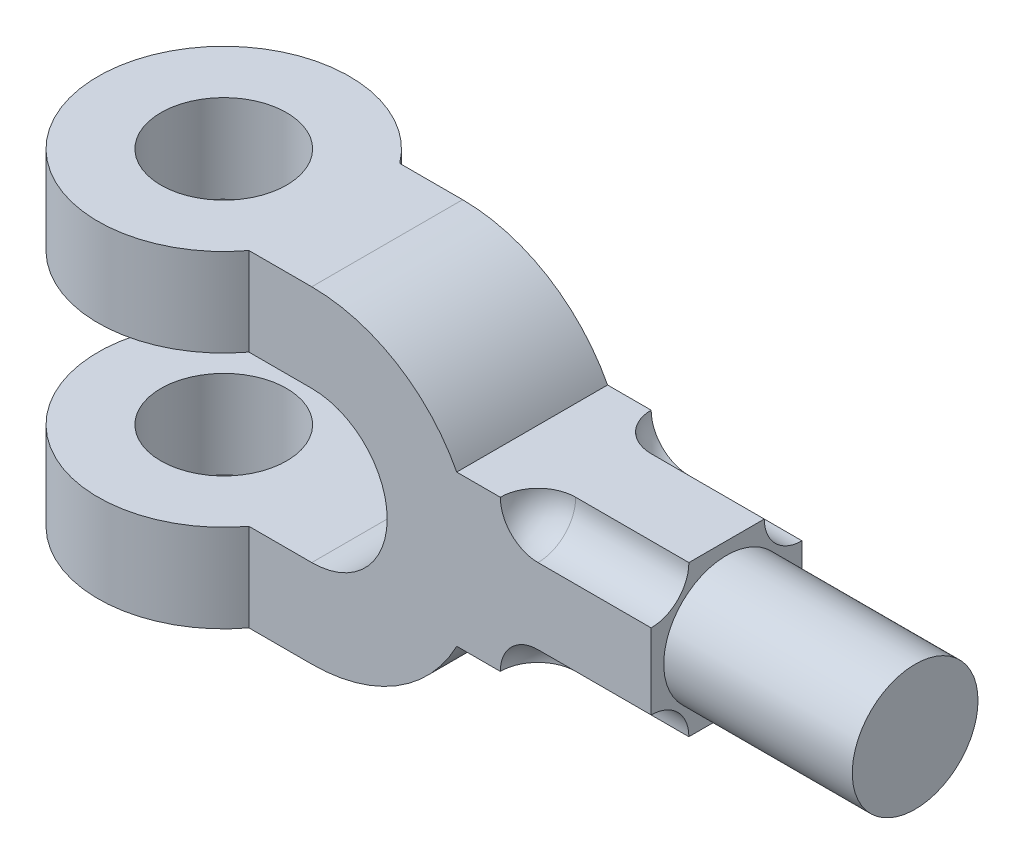
ISO-10303-21;
HEADER;
FILE_DESCRIPTION(('STEP AP214'),'2;1');
FILE_NAME('part.step','',(''),(''),'','','');
FILE_SCHEMA(('AUTOMOTIVE_DESIGN { 1 0 10303 214 1 1 1 1 }'));
ENDSEC;
DATA;
#1=APPLICATION_CONTEXT('core data for automotive mechanical design processes');
#2=APPLICATION_PROTOCOL_DEFINITION('international standard','automotive_design',2000,#1);
#3=PRODUCT_CONTEXT('',#1,'mechanical');
#4=PRODUCT('Part','Part','',(#3));
#5=PRODUCT_RELATED_PRODUCT_CATEGORY('part','',(#4));
#6=PRODUCT_DEFINITION_FORMATION('','',#4);
#7=PRODUCT_DEFINITION_CONTEXT('part definition',#1,'design');
#8=PRODUCT_DEFINITION('design','',#6,#7);
#9=PRODUCT_DEFINITION_SHAPE('','',#8);
#10=(LENGTH_UNIT() NAMED_UNIT(*) SI_UNIT(.MILLI.,.METRE.));
#11=(NAMED_UNIT(*) PLANE_ANGLE_UNIT() SI_UNIT($,.RADIAN.));
#12=(NAMED_UNIT(*) SI_UNIT($,.STERADIAN.) SOLID_ANGLE_UNIT());
#13=UNCERTAINTY_MEASURE_WITH_UNIT(LENGTH_MEASURE(1.E-05),#10,'distance_accuracy_value','');
#14=(GEOMETRIC_REPRESENTATION_CONTEXT(3) GLOBAL_UNCERTAINTY_ASSIGNED_CONTEXT((#13)) GLOBAL_UNIT_ASSIGNED_CONTEXT((#10,
#11,#12)) REPRESENTATION_CONTEXT('',''));
#15=CARTESIAN_POINT('',(0.,0.,0.));
#16=DIRECTION('',(0.,0.,1.));
#17=DIRECTION('',(1.,0.,0.));
#18=AXIS2_PLACEMENT_3D('',#15,#16,#17);
#19=CARTESIAN_POINT('',(0.,52.,0.));
#20=DIRECTION('',(0.,-1.,0.));
#21=DIRECTION('',(0.,0.,-1.));
#22=AXIS2_PLACEMENT_3D('',#19,#20,#21);
#23=CYLINDRICAL_SURFACE('',#22,20.);
#24=DIRECTION('',(0.,-1.,0.));
#25=VECTOR('',#24,1.);
#26=CARTESIAN_POINT('',(15.9999999999998,14.,11.9999999999998));
#27=LINE('',#26,#25);
#28=CARTESIAN_POINT('',(16.,14.,11.9999999999998));
#29=VERTEX_POINT('',#28);
#30=CARTESIAN_POINT('',(16.,0.,11.9999999999998));
#31=VERTEX_POINT('',#30);
#32=EDGE_CURVE('E474',#29,#31,#27,.T.);
#33=ORIENTED_EDGE('',*,*,#32,.F.);
#34=CARTESIAN_POINT('',(0.,14.,0.));
#35=DIRECTION('',(0.,-1.,0.));
#36=DIRECTION('',(0.,0.,-1.));
#37=AXIS2_PLACEMENT_3D('',#34,#35,#36);
#38=CIRCLE('',#37,20.);
#39=CARTESIAN_POINT('',(16.,14.,-12.0000000000002));
#40=VERTEX_POINT('',#39);
#41=EDGE_CURVE('E427',#29,#40,#38,.T.);
#42=ORIENTED_EDGE('',*,*,#41,.T.);
#43=DIRECTION('',(0.,-1.,0.));
#44=VECTOR('',#43,1.);
#45=CARTESIAN_POINT('',(15.9999999999999,14.,-12.0000000000002));
#46=LINE('',#45,#44);
#47=CARTESIAN_POINT('',(16.,0.,-12.0000000000002));
#48=VERTEX_POINT('',#47);
#49=EDGE_CURVE('E225',#40,#48,#46,.T.);
#50=ORIENTED_EDGE('',*,*,#49,.T.);
#51=CARTESIAN_POINT('',(0.,0.,0.));
#52=DIRECTION('',(0.,1.,0.));
#53=DIRECTION('',(0.,0.,1.));
#54=AXIS2_PLACEMENT_3D('',#51,#52,#53);
#55=CIRCLE('',#54,20.);
#56=EDGE_CURVE('E278',#48,#31,#55,.T.);
#57=ORIENTED_EDGE('',*,*,#56,.T.);
#58=EDGE_LOOP('',(#33,#42,#50,#57));
#59=FACE_BOUND('',#58,.T.);
#60=ADVANCED_FACE('F44',(#59),#23,.T.);
#61=DIRECTION('',(0.,-1.,0.));
#62=VECTOR('',#61,1.);
#63=CARTESIAN_POINT('',(15.9999999999999,52.,-12.0000000000002));
#64=LINE('',#63,#62);
#65=CARTESIAN_POINT('',(15.9999999999999,52.,-12.0000000000002));
#66=VERTEX_POINT('',#65);
#67=CARTESIAN_POINT('',(16.,38.,-12.0000000000002));
#68=VERTEX_POINT('',#67);
#69=EDGE_CURVE('E196',#66,#68,#64,.T.);
#70=ORIENTED_EDGE('',*,*,#69,.T.);
#71=CARTESIAN_POINT('',(0.,38.,0.));
#72=DIRECTION('',(0.,1.,0.));
#73=DIRECTION('',(0.,0.,1.));
#74=AXIS2_PLACEMENT_3D('',#71,#72,#73);
#75=CIRCLE('',#74,20.);
#76=CARTESIAN_POINT('',(15.9999999999999,38.,11.9999999999998));
#77=VERTEX_POINT('',#76);
#78=EDGE_CURVE('E181',#68,#77,#75,.T.);
#79=ORIENTED_EDGE('',*,*,#78,.T.);
#80=DIRECTION('',(0.,-1.,0.));
#81=VECTOR('',#80,1.);
#82=CARTESIAN_POINT('',(15.9999999999998,52.,11.9999999999998));
#83=LINE('',#82,#81);
#84=CARTESIAN_POINT('',(16.,52.,11.9999999999998));
#85=VERTEX_POINT('',#84);
#86=EDGE_CURVE('E464',#85,#77,#83,.T.);
#87=ORIENTED_EDGE('',*,*,#86,.F.);
#88=CARTESIAN_POINT('',(0.,52.,0.));
#89=DIRECTION('',(0.,1.,0.));
#90=DIRECTION('',(0.,0.,1.));
#91=AXIS2_PLACEMENT_3D('',#88,#89,#90);
#92=CIRCLE('',#91,20.);
#93=EDGE_CURVE('E203',#66,#85,#92,.T.);
#94=ORIENTED_EDGE('',*,*,#93,.F.);
#95=EDGE_LOOP('',(#70,#79,#87,#94));
#96=FACE_BOUND('',#95,.T.);
#97=ADVANCED_FACE('F200',(#96),#23,.T.);
#98=CARTESIAN_POINT('',(0.,0.,0.));
#99=DIRECTION('',(0.,1.,0.));
#100=DIRECTION('',(0.,0.,1.));
#101=AXIS2_PLACEMENT_3D('',#98,#99,#100);
#102=CYLINDRICAL_SURFACE('',#101,10.);
#103=CARTESIAN_POINT('',(0.,14.,0.));
#104=DIRECTION('',(0.,-1.,0.));
#105=DIRECTION('',(0.,0.,-1.));
#106=AXIS2_PLACEMENT_3D('',#103,#104,#105);
#107=CIRCLE('',#106,10.);
#108=CARTESIAN_POINT('',(0.,14.,10.));
#109=VERTEX_POINT('',#108);
#110=EDGE_CURVE('E47',#109,#109,#107,.F.);
#111=CARTESIAN_POINT('',(0.,0.,0.));
#112=DIRECTION('',(0.,1.,0.));
#113=DIRECTION('',(0.,0.,1.));
#114=AXIS2_PLACEMENT_3D('',#111,#112,#113);
#115=CIRCLE('',#114,10.);
#116=CARTESIAN_POINT('',(0.,0.,10.));
#117=VERTEX_POINT('',#116);
#118=EDGE_CURVE('E277',#117,#117,#115,.T.);
#119=CARTESIAN_POINT('',(0.,14.,10.));
#120=CARTESIAN_POINT('',(0.,13.8541666666667,10.));
#121=CARTESIAN_POINT('',(0.,13.7083333333333,10.));
#122=CARTESIAN_POINT('',(0.,13.4166666666667,10.));
#123=CARTESIAN_POINT('',(0.,13.2708333333333,10.));
#124=CARTESIAN_POINT('',(0.,12.9791666666667,10.));
#125=CARTESIAN_POINT('',(0.,12.8333333333333,10.));
#126=CARTESIAN_POINT('',(0.,12.5416666666667,10.));
#127=CARTESIAN_POINT('',(0.,12.3958333333333,10.));
#128=CARTESIAN_POINT('',(0.,12.1041666666667,10.));
#129=CARTESIAN_POINT('',(0.,11.9583333333333,10.));
#130=CARTESIAN_POINT('',(0.,11.6666666666667,10.));
#131=CARTESIAN_POINT('',(0.,11.5208333333333,10.));
#132=CARTESIAN_POINT('',(0.,11.2291666666667,10.));
#133=CARTESIAN_POINT('',(0.,11.0833333333333,10.));
#134=CARTESIAN_POINT('',(0.,10.7916666666667,10.));
#135=CARTESIAN_POINT('',(0.,10.6458333333333,10.));
#136=CARTESIAN_POINT('',(0.,10.3541666666667,10.));
#137=CARTESIAN_POINT('',(0.,10.2083333333333,10.));
#138=CARTESIAN_POINT('',(0.,9.91666666666668,10.));
#139=CARTESIAN_POINT('',(0.,9.77083333333334,10.));
#140=CARTESIAN_POINT('',(0.,9.47916666666668,10.));
#141=CARTESIAN_POINT('',(0.,9.33333333333334,10.));
#142=CARTESIAN_POINT('',(0.,9.04166666666667,10.));
#143=CARTESIAN_POINT('',(0.,8.89583333333334,10.));
#144=CARTESIAN_POINT('',(0.,8.60416666666667,10.));
#145=CARTESIAN_POINT('',(0.,8.45833333333334,10.));
#146=CARTESIAN_POINT('',(0.,8.16666666666667,10.));
#147=CARTESIAN_POINT('',(0.,8.02083333333334,10.));
#148=CARTESIAN_POINT('',(0.,7.72916666666667,10.));
#149=CARTESIAN_POINT('',(0.,7.58333333333334,10.));
#150=CARTESIAN_POINT('',(0.,7.29166666666667,10.));
#151=CARTESIAN_POINT('',(0.,7.14583333333334,10.));
#152=CARTESIAN_POINT('',(0.,6.85416666666667,10.));
#153=CARTESIAN_POINT('',(0.,6.70833333333334,10.));
#154=CARTESIAN_POINT('',(0.,6.41666666666667,10.));
#155=CARTESIAN_POINT('',(0.,6.27083333333334,10.));
#156=CARTESIAN_POINT('',(0.,5.97916666666667,10.));
#157=CARTESIAN_POINT('',(0.,5.83333333333334,10.));
#158=CARTESIAN_POINT('',(0.,5.54166666666667,10.));
#159=CARTESIAN_POINT('',(0.,5.39583333333334,10.));
#160=CARTESIAN_POINT('',(0.,5.10416666666667,10.));
#161=CARTESIAN_POINT('',(0.,4.95833333333334,10.));
#162=CARTESIAN_POINT('',(0.,4.66666666666667,10.));
#163=CARTESIAN_POINT('',(0.,4.52083333333334,10.));
#164=CARTESIAN_POINT('',(0.,4.22916666666667,10.));
#165=CARTESIAN_POINT('',(0.,4.08333333333334,10.));
#166=CARTESIAN_POINT('',(0.,3.79166666666667,10.));
#167=CARTESIAN_POINT('',(0.,3.64583333333334,10.));
#168=CARTESIAN_POINT('',(0.,3.35416666666667,10.));
#169=CARTESIAN_POINT('',(0.,3.20833333333334,10.));
#170=CARTESIAN_POINT('',(0.,2.91666666666667,10.));
#171=CARTESIAN_POINT('',(0.,2.77083333333334,10.));
#172=CARTESIAN_POINT('',(0.,2.47916666666667,10.));
#173=CARTESIAN_POINT('',(0.,2.33333333333333,10.));
#174=CARTESIAN_POINT('',(0.,2.04166666666667,10.));
#175=CARTESIAN_POINT('',(0.,1.89583333333333,10.));
#176=CARTESIAN_POINT('',(0.,1.60416666666667,10.));
#177=CARTESIAN_POINT('',(0.,1.45833333333333,10.));
#178=CARTESIAN_POINT('',(0.,1.16666666666667,10.));
#179=CARTESIAN_POINT('',(0.,1.02083333333333,10.));
#180=CARTESIAN_POINT('',(0.,0.729166666666667,10.));
#181=CARTESIAN_POINT('',(0.,0.583333333333334,10.));
#182=CARTESIAN_POINT('',(0.,0.291666666666667,10.));
#183=CARTESIAN_POINT('',(0.,0.145833333333333,10.));
#184=CARTESIAN_POINT('',(0.,0.,10.));
#185=B_SPLINE_CURVE_WITH_KNOTS('',3,(#119,#120,#121,#122,#123,#124,#125,#126,#127,#128,#129,
#130,#131,#132,#133,#134,#135,#136,#137,#138,#139,#140,#141,#142,#143,#144,#145,#146,#147,#148,
#149,#150,#151,#152,#153,#154,#155,#156,#157,#158,#159,#160,#161,#162,#163,#164,#165,#166,#167,
#168,#169,#170,#171,#172,#173,#174,#175,#176,#177,#178,#179,#180,#181,#182,#183,#184),
.UNSPECIFIED.,.F.,.F.,(4,2,2,2,2,2,2,2,2,2,2,2,2,2,2,2,2,2,2,2,2,2,2,2,2,2,2,2,2,2,2,2,4),(0.,
0.4375,0.875000000000001,1.3125,1.75,2.1875,2.625,3.0625,3.5,3.9375,4.375,4.8125,
5.25000000000001,5.68750000000001,6.12500000000001,6.56250000000001,7.00000000000001,
7.43750000000001,7.87500000000001,8.31250000000001,8.75000000000001,9.18750000000001,
9.62500000000001,10.0625,10.5,10.9375,11.375,11.8125,12.25,12.6875,13.125,13.5625,14.),.UNSPECIFIED.);
#186=EDGE_CURVE('BSEAM303',#109,#117,#185,.T.);
#187=ORIENTED_EDGE('',*,*,#110,.T.);
#188=ORIENTED_EDGE('',*,*,#118,.F.);
#189=ORIENTED_EDGE('',*,*,#186,.T.);
#190=ORIENTED_EDGE('',*,*,#186,.F.);
#191=EDGE_LOOP('',(#187,#189,#188,#190));
#192=FACE_BOUND('',#191,.T.);
#193=ADVANCED_FACE('F303',(#192),#102,.F.);
#194=CARTESIAN_POINT('',(49.0651251893416,14.,11.9999999999891));
#195=DIRECTION('',(0.,1.,0.));
#196=DIRECTION('',(-1.,0.,0.));
#197=AXIS2_PLACEMENT_3D('',#194,#195,#196);
#198=PLANE('',#197);
#199=DIRECTION('',(-1.,0.,0.));
#200=VECTOR('',#199,1.);
#201=CARTESIAN_POINT('',(109.999999999995,14.,6.00000000000001));
#202=LINE('',#201,#200);
#203=CARTESIAN_POINT('',(61.9999999999946,14.,5.99999999999246));
#204=VERTEX_POINT('',#203);
#205=CARTESIAN_POINT('',(79.9999999999946,14.,5.99999999998913));
#206=VERTEX_POINT('',#205);
#207=EDGE_CURVE('E447',#204,#206,#202,.F.);
#208=ORIENTED_EDGE('',*,*,#207,.F.);
#209=CARTESIAN_POINT('',(61.9999999999999,14.,11.9999999999925));
#210=DIRECTION('',(0.,1.,0.));
#211=DIRECTION('',(-1.,0.,0.));
#212=AXIS2_PLACEMENT_3D('',#209,#210,#211);
#213=CIRCLE('',#212,6.);
#214=CARTESIAN_POINT('',(55.9999999999999,14.,11.9999999999925));
#215=VERTEX_POINT('',#214);
#216=EDGE_CURVE('E356',#204,#215,#213,.T.);
#217=ORIENTED_EDGE('',*,*,#216,.T.);
#218=DIRECTION('',(1.,0.,0.));
#219=VECTOR('',#218,1.);
#220=CARTESIAN_POINT('',(49.0651251893416,14.,11.9999999999891));
#221=LINE('',#220,#219);
#222=CARTESIAN_POINT('',(49.0651251893416,14.,11.9999999999891));
#223=VERTEX_POINT('',#222);
#224=EDGE_CURVE('E484',#223,#215,#221,.T.);
#225=ORIENTED_EDGE('',*,*,#224,.F.);
#226=DIRECTION('',(0.,0.,-1.));
#227=VECTOR('',#226,1.);
#228=CARTESIAN_POINT('',(49.0651251893416,14.,11.9999999999891));
#229=LINE('',#228,#227);
#230=CARTESIAN_POINT('',(49.0651251893416,14.,-12.0000000000107));
#231=VERTEX_POINT('',#230);
#232=EDGE_CURVE('E258',#223,#231,#229,.T.);
#233=ORIENTED_EDGE('',*,*,#232,.T.);
#234=DIRECTION('',(1.,0.,0.));
#235=VECTOR('',#234,1.);
#236=CARTESIAN_POINT('',(49.0651251893416,14.,-12.0000000000107));
#237=LINE('',#236,#235);
#238=CARTESIAN_POINT('',(56.,14.,-12.0000000000076));
#239=VERTEX_POINT('',#238);
#240=EDGE_CURVE('E231',#231,#239,#237,.T.);
#241=ORIENTED_EDGE('',*,*,#240,.T.);
#242=CARTESIAN_POINT('',(62.0000000000001,14.,-12.0000000000076));
#243=DIRECTION('',(0.,1.,0.));
#244=DIRECTION('',(-1.,0.,0.));
#245=AXIS2_PLACEMENT_3D('',#242,#243,#244);
#246=CIRCLE('',#245,6.);
#247=CARTESIAN_POINT('',(61.9999999999999,14.,-6.00000000000755));
#248=VERTEX_POINT('',#247);
#249=EDGE_CURVE('E353',#239,#248,#246,.T.);
#250=ORIENTED_EDGE('',*,*,#249,.T.);
#251=DIRECTION('',(-1.,0.,0.));
#252=VECTOR('',#251,1.);
#253=CARTESIAN_POINT('',(110.,14.,-6.00000000000001));
#254=LINE('',#253,#252);
#255=CARTESIAN_POINT('',(80.,14.,-6.00000000001066));
#256=VERTEX_POINT('',#255);
#257=EDGE_CURVE('E430',#256,#248,#254,.T.);
#258=ORIENTED_EDGE('',*,*,#257,.F.);
#259=DIRECTION('',(0.,0.,-1.));
#260=VECTOR('',#259,1.);
#261=CARTESIAN_POINT('',(80.,14.,11.9999999999891));
#262=LINE('',#261,#260);
#263=EDGE_CURVE('E252',#206,#256,#262,.T.);
#264=ORIENTED_EDGE('',*,*,#263,.F.);
#265=EDGE_LOOP('',(#208,#217,#225,#233,#241,#250,#258,#264));
#266=FACE_BOUND('',#265,.T.);
#267=ADVANCED_FACE('F521',(#266),#198,.F.);
#268=CARTESIAN_POINT('',(49.0651251893416,38.,11.9999999999891));
#269=DIRECTION('',(0.,-1.,0.));
#270=DIRECTION('',(0.,0.,-1.));
#271=AXIS2_PLACEMENT_3D('',#268,#269,#270);
#272=PLANE('',#271);
#273=DIRECTION('',(-1.,0.,0.));
#274=VECTOR('',#273,1.);
#275=CARTESIAN_POINT('',(110.,38.,-6.00000000000001));
#276=LINE('',#275,#274);
#277=CARTESIAN_POINT('',(61.9999999999999,38.,-6.00000000000755));
#278=VERTEX_POINT('',#277);
#279=CARTESIAN_POINT('',(80.,38.,-6.00000000001066));
#280=VERTEX_POINT('',#279);
#281=EDGE_CURVE('E411',#278,#280,#276,.F.);
#282=ORIENTED_EDGE('',*,*,#281,.F.);
#283=CARTESIAN_POINT('',(62.0000000000001,38.,-12.0000000000076));
#284=DIRECTION('',(0.,-1.,0.));
#285=DIRECTION('',(0.,0.,-1.));
#286=AXIS2_PLACEMENT_3D('',#283,#284,#285);
#287=CIRCLE('',#286,6.);
#288=CARTESIAN_POINT('',(56.,38.,-12.0000000000076));
#289=VERTEX_POINT('',#288);
#290=EDGE_CURVE('E368',#278,#289,#287,.T.);
#291=ORIENTED_EDGE('',*,*,#290,.T.);
#292=DIRECTION('',(-1.,0.,0.));
#293=VECTOR('',#292,1.);
#294=CARTESIAN_POINT('',(49.0651251893416,38.,-12.0000000000107));
#295=LINE('',#294,#293);
#296=CARTESIAN_POINT('',(49.0651251893416,38.,-12.0000000000107));
#297=VERTEX_POINT('',#296);
#298=EDGE_CURVE('E239',#289,#297,#295,.T.);
#299=ORIENTED_EDGE('',*,*,#298,.T.);
#300=DIRECTION('',(0.,0.,-1.));
#301=VECTOR('',#300,1.);
#302=CARTESIAN_POINT('',(49.0651251893416,38.,11.9999999999891));
#303=LINE('',#302,#301);
#304=CARTESIAN_POINT('',(49.0651251893416,38.,11.9999999999891));
#305=VERTEX_POINT('',#304);
#306=EDGE_CURVE('E241',#305,#297,#303,.T.);
#307=ORIENTED_EDGE('',*,*,#306,.F.);
#308=DIRECTION('',(-1.,0.,0.));
#309=VECTOR('',#308,1.);
#310=CARTESIAN_POINT('',(49.0651251893416,38.,11.9999999999891));
#311=LINE('',#310,#309);
#312=CARTESIAN_POINT('',(55.9999999999999,38.,11.9999999999925));
#313=VERTEX_POINT('',#312);
#314=EDGE_CURVE('E248',#313,#305,#311,.T.);
#315=ORIENTED_EDGE('',*,*,#314,.F.);
#316=CARTESIAN_POINT('',(61.9999999999999,38.,11.9999999999925));
#317=DIRECTION('',(0.,-1.,0.));
#318=DIRECTION('',(0.,0.,-1.));
#319=AXIS2_PLACEMENT_3D('',#316,#317,#318);
#320=CIRCLE('',#319,6.);
#321=CARTESIAN_POINT('',(61.9999999999946,38.,5.99999999999246));
#322=VERTEX_POINT('',#321);
#323=EDGE_CURVE('E54',#313,#322,#320,.T.);
#324=ORIENTED_EDGE('',*,*,#323,.T.);
#325=DIRECTION('',(-1.,0.,0.));
#326=VECTOR('',#325,1.);
#327=CARTESIAN_POINT('',(109.999999999995,38.,6.00000000000001));
#328=LINE('',#327,#326);
#329=CARTESIAN_POINT('',(79.9999999999946,38.,5.99999999998913));
#330=VERTEX_POINT('',#329);
#331=EDGE_CURVE('E438',#330,#322,#328,.T.);
#332=ORIENTED_EDGE('',*,*,#331,.F.);
#333=DIRECTION('',(0.,0.,-1.));
#334=VECTOR('',#333,1.);
#335=CARTESIAN_POINT('',(80.,38.,11.9999999999891));
#336=LINE('',#335,#334);
#337=EDGE_CURVE('E250',#330,#280,#336,.T.);
#338=ORIENTED_EDGE('',*,*,#337,.T.);
#339=EDGE_LOOP('',(#282,#291,#299,#307,#315,#324,#332,#338));
#340=FACE_BOUND('',#339,.T.);
#341=ADVANCED_FACE('F416',(#340),#272,.F.);
#342=CARTESIAN_POINT('',(26.,26.,11.9999999999925));
#343=DIRECTION('',(0.,0.,1.));
#344=DIRECTION('',(1.,0.,0.));
#345=AXIS2_PLACEMENT_3D('',#342,#343,#344);
#346=PLANE('',#345);
#347=ORIENTED_EDGE('',*,*,#224,.T.);
#348=CARTESIAN_POINT('',(61.9999999999999,14.,11.9999999999925));
#349=DIRECTION('',(0.,0.,1.));
#350=DIRECTION('',(1.,0.,0.));
#351=AXIS2_PLACEMENT_3D('',#348,#349,#350);
#352=CIRCLE('',#351,6.);
#353=CARTESIAN_POINT('',(61.9999999999999,20.,11.9999999999925));
#354=VERTEX_POINT('',#353);
#355=EDGE_CURVE('E360',#215,#354,#352,.F.);
#356=ORIENTED_EDGE('',*,*,#355,.T.);
#357=DIRECTION('',(-1.,0.,0.));
#358=VECTOR('',#357,1.);
#359=CARTESIAN_POINT('',(110.,20.,11.9999999999998));
#360=LINE('',#359,#358);
#361=CARTESIAN_POINT('',(80.,20.,11.9999999999891));
#362=VERTEX_POINT('',#361);
#363=EDGE_CURVE('E334',#354,#362,#360,.F.);
#364=ORIENTED_EDGE('',*,*,#363,.T.);
#365=DIRECTION('',(0.,1.,0.));
#366=VECTOR('',#365,1.);
#367=CARTESIAN_POINT('',(80.,38.,11.9999999999891));
#368=LINE('',#367,#366);
#369=CARTESIAN_POINT('',(80.,32.,11.9999999999891));
#370=VERTEX_POINT('',#369);
#371=EDGE_CURVE('E487',#362,#370,#368,.T.);
#372=ORIENTED_EDGE('',*,*,#371,.T.);
#373=DIRECTION('',(-1.,0.,0.));
#374=VECTOR('',#373,1.);
#375=CARTESIAN_POINT('',(110.,32.,11.9999999999998));
#376=LINE('',#375,#374);
#377=CARTESIAN_POINT('',(61.9999999999999,32.,11.9999999999925));
#378=VERTEX_POINT('',#377);
#379=EDGE_CURVE('E328',#370,#378,#376,.T.);
#380=ORIENTED_EDGE('',*,*,#379,.T.);
#381=CARTESIAN_POINT('',(61.9999999999999,38.,11.9999999999925));
#382=DIRECTION('',(0.,0.,1.));
#383=DIRECTION('',(1.,0.,0.));
#384=AXIS2_PLACEMENT_3D('',#381,#382,#383);
#385=CIRCLE('',#384,6.);
#386=EDGE_CURVE('E12',#378,#313,#385,.F.);
#387=ORIENTED_EDGE('',*,*,#386,.T.);
#388=ORIENTED_EDGE('',*,*,#314,.T.);
#389=CARTESIAN_POINT('',(26.,26.,11.9999999999925));
#390=DIRECTION('',(0.,0.,1.));
#391=DIRECTION('',(1.,0.,0.));
#392=AXIS2_PLACEMENT_3D('',#389,#390,#391);
#393=CIRCLE('',#392,26.);
#394=CARTESIAN_POINT('',(26.,52.,11.9999999999925));
#395=VERTEX_POINT('',#394);
#396=EDGE_CURVE('E245',#305,#395,#393,.T.);
#397=ORIENTED_EDGE('',*,*,#396,.T.);
#398=DIRECTION('',(-1.,0.,0.));
#399=VECTOR('',#398,1.);
#400=CARTESIAN_POINT('',(26.,52.,11.9999999999925));
#401=LINE('',#400,#399);
#402=EDGE_CURVE('E458',#395,#85,#401,.T.);
#403=ORIENTED_EDGE('',*,*,#402,.T.);
#404=ORIENTED_EDGE('',*,*,#86,.T.);
#405=DIRECTION('',(1.,0.,0.));
#406=VECTOR('',#405,1.);
#407=CARTESIAN_POINT('',(25.9999999999999,38.,11.9999999999925));
#408=LINE('',#407,#406);
#409=CARTESIAN_POINT('',(25.9999999999999,38.,11.9999999999925));
#410=VERTEX_POINT('',#409);
#411=EDGE_CURVE('E192',#77,#410,#408,.T.);
#412=ORIENTED_EDGE('',*,*,#411,.T.);
#413=CARTESIAN_POINT('',(26.,26.,11.9999999999925));
#414=DIRECTION('',(0.,0.,-1.));
#415=DIRECTION('',(1.,0.,0.));
#416=AXIS2_PLACEMENT_3D('',#413,#414,#415);
#417=CIRCLE('',#416,12.);
#418=CARTESIAN_POINT('',(26.0000000000001,14.,11.9999999999925));
#419=VERTEX_POINT('',#418);
#420=EDGE_CURVE('E469',#410,#419,#417,.T.);
#421=ORIENTED_EDGE('',*,*,#420,.T.);
#422=DIRECTION('',(-1.,0.,0.));
#423=VECTOR('',#422,1.);
#424=CARTESIAN_POINT('',(26.0000000000001,14.,11.9999999999925));
#425=LINE('',#424,#423);
#426=EDGE_CURVE('E472',#419,#29,#425,.T.);
#427=ORIENTED_EDGE('',*,*,#426,.T.);
#428=ORIENTED_EDGE('',*,*,#32,.T.);
#429=DIRECTION('',(1.,0.,0.));
#430=VECTOR('',#429,1.);
#431=CARTESIAN_POINT('',(26.,0.,11.9999999999925));
#432=LINE('',#431,#430);
#433=CARTESIAN_POINT('',(26.,0.,11.9999999999925));
#434=VERTEX_POINT('',#433);
#435=EDGE_CURVE('E479',#31,#434,#432,.T.);
#436=ORIENTED_EDGE('',*,*,#435,.T.);
#437=CARTESIAN_POINT('',(26.,26.,11.9999999999925));
#438=DIRECTION('',(0.,0.,1.));
#439=DIRECTION('',(1.,0.,0.));
#440=AXIS2_PLACEMENT_3D('',#437,#438,#439);
#441=CIRCLE('',#440,26.);
#442=EDGE_CURVE('E485',#434,#223,#441,.T.);
#443=ORIENTED_EDGE('',*,*,#442,.T.);
#444=EDGE_LOOP('',(#347,#356,#364,#372,#380,#387,#388,#397,#403,#404,#412,#421,#427,#428,#436,#443));
#445=FACE_BOUND('',#444,.T.);
#446=ADVANCED_FACE('F508',(#445),#346,.T.);
#447=CARTESIAN_POINT('',(26.,26.,-12.0000000000076));
#448=DIRECTION('',(0.,0.,1.));
#449=DIRECTION('',(1.,0.,0.));
#450=AXIS2_PLACEMENT_3D('',#447,#448,#449);
#451=PLANE('',#450);
#452=DIRECTION('',(-1.,0.,0.));
#453=VECTOR('',#452,1.);
#454=CARTESIAN_POINT('',(110.,20.,-12.));
#455=LINE('',#454,#453);
#456=CARTESIAN_POINT('',(62.0000000000001,20.,-12.0000000000076));
#457=VERTEX_POINT('',#456);
#458=CARTESIAN_POINT('',(80.,20.,-12.0000000000107));
#459=VERTEX_POINT('',#458);
#460=EDGE_CURVE('E324',#457,#459,#455,.F.);
#461=ORIENTED_EDGE('',*,*,#460,.F.);
#462=CARTESIAN_POINT('',(62.0000000000001,14.,-12.0000000000076));
#463=DIRECTION('',(0.,0.,1.));
#464=DIRECTION('',(1.,0.,0.));
#465=AXIS2_PLACEMENT_3D('',#462,#463,#464);
#466=CIRCLE('',#465,6.);
#467=EDGE_CURVE('E354',#457,#239,#466,.T.);
#468=ORIENTED_EDGE('',*,*,#467,.T.);
#469=ORIENTED_EDGE('',*,*,#240,.F.);
#470=CARTESIAN_POINT('',(26.,26.,-12.0000000000076));
#471=DIRECTION('',(0.,0.,1.));
#472=DIRECTION('',(1.,0.,0.));
#473=AXIS2_PLACEMENT_3D('',#470,#471,#472);
#474=CIRCLE('',#473,26.);
#475=CARTESIAN_POINT('',(26.,0.,-12.0000000000076));
#476=VERTEX_POINT('',#475);
#477=EDGE_CURVE('E230',#476,#231,#474,.T.);
#478=ORIENTED_EDGE('',*,*,#477,.F.);
#479=DIRECTION('',(1.,0.,0.));
#480=VECTOR('',#479,1.);
#481=CARTESIAN_POINT('',(26.,0.,-12.0000000000076));
#482=LINE('',#481,#480);
#483=EDGE_CURVE('E223',#48,#476,#482,.T.);
#484=ORIENTED_EDGE('',*,*,#483,.F.);
#485=ORIENTED_EDGE('',*,*,#49,.F.);
#486=DIRECTION('',(-1.,0.,0.));
#487=VECTOR('',#486,1.);
#488=CARTESIAN_POINT('',(26.0000000000001,14.,-12.0000000000076));
#489=LINE('',#488,#487);
#490=CARTESIAN_POINT('',(26.0000000000001,14.,-12.0000000000076));
#491=VERTEX_POINT('',#490);
#492=EDGE_CURVE('E216',#491,#40,#489,.T.);
#493=ORIENTED_EDGE('',*,*,#492,.F.);
#494=CARTESIAN_POINT('',(26.,26.,-12.0000000000076));
#495=DIRECTION('',(0.,0.,-1.));
#496=DIRECTION('',(1.,0.,0.));
#497=AXIS2_PLACEMENT_3D('',#494,#495,#496);
#498=CIRCLE('',#497,12.);
#499=CARTESIAN_POINT('',(26.,38.,-12.0000000000076));
#500=VERTEX_POINT('',#499);
#501=EDGE_CURVE('E211',#500,#491,#498,.T.);
#502=ORIENTED_EDGE('',*,*,#501,.F.);
#503=DIRECTION('',(1.,0.,0.));
#504=VECTOR('',#503,1.);
#505=CARTESIAN_POINT('',(26.,38.,-12.0000000000076));
#506=LINE('',#505,#504);
#507=EDGE_CURVE('E189',#68,#500,#506,.T.);
#508=ORIENTED_EDGE('',*,*,#507,.F.);
#509=ORIENTED_EDGE('',*,*,#69,.F.);
#510=DIRECTION('',(-1.,0.,0.));
#511=VECTOR('',#510,1.);
#512=CARTESIAN_POINT('',(26.,52.,-12.0000000000076));
#513=LINE('',#512,#511);
#514=CARTESIAN_POINT('',(26.,52.,-12.0000000000076));
#515=VERTEX_POINT('',#514);
#516=EDGE_CURVE('E202',#515,#66,#513,.T.);
#517=ORIENTED_EDGE('',*,*,#516,.F.);
#518=CARTESIAN_POINT('',(26.,26.,-12.0000000000076));
#519=DIRECTION('',(0.,0.,1.));
#520=DIRECTION('',(1.,0.,0.));
#521=AXIS2_PLACEMENT_3D('',#518,#519,#520);
#522=CIRCLE('',#521,26.);
#523=EDGE_CURVE('E453',#297,#515,#522,.T.);
#524=ORIENTED_EDGE('',*,*,#523,.F.);
#525=ORIENTED_EDGE('',*,*,#298,.F.);
#526=CARTESIAN_POINT('',(62.0000000000001,38.,-12.0000000000076));
#527=DIRECTION('',(0.,0.,1.));
#528=DIRECTION('',(1.,0.,0.));
#529=AXIS2_PLACEMENT_3D('',#526,#527,#528);
#530=CIRCLE('',#529,6.);
#531=CARTESIAN_POINT('',(62.0000000000001,32.,-12.0000000000076));
#532=VERTEX_POINT('',#531);
#533=EDGE_CURVE('E361',#289,#532,#530,.T.);
#534=ORIENTED_EDGE('',*,*,#533,.T.);
#535=DIRECTION('',(-1.,0.,0.));
#536=VECTOR('',#535,1.);
#537=CARTESIAN_POINT('',(110.,32.,-12.));
#538=LINE('',#537,#536);
#539=CARTESIAN_POINT('',(80.,32.,-12.0000000000107));
#540=VERTEX_POINT('',#539);
#541=EDGE_CURVE('E316',#540,#532,#538,.T.);
#542=ORIENTED_EDGE('',*,*,#541,.F.);
#543=DIRECTION('',(0.,1.,0.));
#544=VECTOR('',#543,1.);
#545=CARTESIAN_POINT('',(80.,38.,-12.0000000000107));
#546=LINE('',#545,#544);
#547=EDGE_CURVE('E234',#459,#540,#546,.T.);
#548=ORIENTED_EDGE('',*,*,#547,.F.);
#549=EDGE_LOOP('',(#461,#468,#469,#478,#484,#485,#493,#502,#508,#509,#517,#524,#525,#534,#542,#548));
#550=FACE_BOUND('',#549,.T.);
#551=ADVANCED_FACE('F207',(#550),#451,.F.);
#552=CARTESIAN_POINT('',(0.,52.,0.));
#553=DIRECTION('',(0.,1.,0.));
#554=DIRECTION('',(0.,0.,1.));
#555=AXIS2_PLACEMENT_3D('',#552,#553,#554);
#556=PLANE('',#555);
#557=ORIENTED_EDGE('',*,*,#93,.T.);
#558=ORIENTED_EDGE('',*,*,#402,.F.);
#559=DIRECTION('',(0.,0.,-1.));
#560=VECTOR('',#559,1.);
#561=CARTESIAN_POINT('',(26.,52.,11.9999999999925));
#562=LINE('',#561,#560);
#563=EDGE_CURVE('E271',#395,#515,#562,.T.);
#564=ORIENTED_EDGE('',*,*,#563,.T.);
#565=ORIENTED_EDGE('',*,*,#516,.T.);
#566=EDGE_LOOP('',(#557,#558,#564,#565));
#567=FACE_BOUND('',#566,.T.);
#568=CARTESIAN_POINT('',(0.,52.000012,0.));
#569=DIRECTION('',(0.,1.,0.));
#570=DIRECTION('',(0.,0.,1.));
#571=AXIS2_PLACEMENT_3D('',#568,#569,#570);
#572=CIRCLE('',#571,10.);
#573=CARTESIAN_POINT('',(0.,52.000012,10.));
#574=VERTEX_POINT('',#573);
#575=EDGE_CURVE('E274',#574,#574,#572,.T.);
#576=ORIENTED_EDGE('',*,*,#575,.F.);
#577=EDGE_LOOP('',(#576));
#578=FACE_BOUND('',#577,.T.);
#579=ADVANCED_FACE('F301',(#567,#578),#556,.T.);
#580=CARTESIAN_POINT('',(0.,0.,0.));
#581=DIRECTION('',(0.,1.,0.));
#582=DIRECTION('',(0.,0.,1.));
#583=AXIS2_PLACEMENT_3D('',#580,#581,#582);
#584=PLANE('',#583);
#585=ORIENTED_EDGE('',*,*,#56,.F.);
#586=ORIENTED_EDGE('',*,*,#483,.T.);
#587=DIRECTION('',(0.,0.,-1.));
#588=VECTOR('',#587,1.);
#589=CARTESIAN_POINT('',(26.,0.,11.9999999999925));
#590=LINE('',#589,#588);
#591=EDGE_CURVE('E257',#434,#476,#590,.T.);
#592=ORIENTED_EDGE('',*,*,#591,.F.);
#593=ORIENTED_EDGE('',*,*,#435,.F.);
#594=EDGE_LOOP('',(#585,#586,#592,#593));
#595=FACE_BOUND('',#594,.T.);
#596=ORIENTED_EDGE('',*,*,#118,.T.);
#597=EDGE_LOOP('',(#596));
#598=FACE_BOUND('',#597,.T.);
#599=ADVANCED_FACE('F302',(#595,#598),#584,.F.);
#600=CARTESIAN_POINT('',(0.,38.,0.));
#601=DIRECTION('',(0.,1.,0.));
#602=DIRECTION('',(0.,0.,1.));
#603=AXIS2_PLACEMENT_3D('',#600,#601,#602);
#604=CIRCLE('',#603,10.);
#605=CARTESIAN_POINT('',(0.,38.,10.));
#606=VERTEX_POINT('',#605);
#607=EDGE_CURVE('E191',#606,#606,#604,.F.);
#608=ORIENTED_EDGE('',*,*,#607,.T.);
#609=EDGE_LOOP('',(#608));
#610=FACE_BOUND('',#609,.T.);
#611=ORIENTED_EDGE('',*,*,#575,.T.);
#612=EDGE_LOOP('',(#611));
#613=FACE_BOUND('',#612,.T.);
#614=ADVANCED_FACE('F289',(#610,#613),#102,.F.);
#615=CARTESIAN_POINT('',(26.,26.,11.9999999999925));
#616=DIRECTION('',(0.,0.,-1.));
#617=DIRECTION('',(-1.,0.,0.));
#618=AXIS2_PLACEMENT_3D('',#615,#616,#617);
#619=CYLINDRICAL_SURFACE('',#618,26.);
#620=ORIENTED_EDGE('',*,*,#523,.T.);
#621=ORIENTED_EDGE('',*,*,#563,.F.);
#622=ORIENTED_EDGE('',*,*,#396,.F.);
#623=ORIENTED_EDGE('',*,*,#306,.T.);
#624=EDGE_LOOP('',(#620,#621,#622,#623));
#625=FACE_BOUND('',#624,.T.);
#626=ADVANCED_FACE('F297',(#625),#619,.T.);
#627=CARTESIAN_POINT('',(25.9999999999999,38.,11.9999999999925));
#628=DIRECTION('',(0.,1.,0.));
#629=DIRECTION('',(-1.,0.,0.));
#630=AXIS2_PLACEMENT_3D('',#627,#628,#629);
#631=PLANE('',#630);
#632=ORIENTED_EDGE('',*,*,#507,.T.);
#633=DIRECTION('',(0.,0.,-1.));
#634=VECTOR('',#633,1.);
#635=CARTESIAN_POINT('',(25.9999999999999,38.,11.9999999999925));
#636=LINE('',#635,#634);
#637=EDGE_CURVE('E268',#410,#500,#636,.T.);
#638=ORIENTED_EDGE('',*,*,#637,.F.);
#639=ORIENTED_EDGE('',*,*,#411,.F.);
#640=ORIENTED_EDGE('',*,*,#78,.F.);
#641=EDGE_LOOP('',(#632,#638,#639,#640));
#642=FACE_BOUND('',#641,.T.);
#643=ORIENTED_EDGE('',*,*,#607,.F.);
#644=EDGE_LOOP('',(#643));
#645=FACE_BOUND('',#644,.T.);
#646=ADVANCED_FACE('F183',(#642,#645),#631,.F.);
#647=CARTESIAN_POINT('',(26.,26.,11.9999999999925));
#648=DIRECTION('',(0.,0.,-1.));
#649=DIRECTION('',(-1.,0.,0.));
#650=AXIS2_PLACEMENT_3D('',#647,#648,#649);
#651=CYLINDRICAL_SURFACE('',#650,12.);
#652=ORIENTED_EDGE('',*,*,#501,.T.);
#653=DIRECTION('',(0.,0.,-1.));
#654=VECTOR('',#653,1.);
#655=CARTESIAN_POINT('',(26.0000000000001,14.,11.9999999999925));
#656=LINE('',#655,#654);
#657=EDGE_CURVE('E262',#419,#491,#656,.T.);
#658=ORIENTED_EDGE('',*,*,#657,.F.);
#659=ORIENTED_EDGE('',*,*,#420,.F.);
#660=ORIENTED_EDGE('',*,*,#637,.T.);
#661=EDGE_LOOP('',(#652,#658,#659,#660));
#662=FACE_BOUND('',#661,.T.);
#663=ADVANCED_FACE('F374',(#662),#651,.F.);
#664=CARTESIAN_POINT('',(26.0000000000001,14.,11.9999999999925));
#665=DIRECTION('',(0.,-1.,0.));
#666=DIRECTION('',(0.,0.,-1.));
#667=AXIS2_PLACEMENT_3D('',#664,#665,#666);
#668=PLANE('',#667);
#669=ORIENTED_EDGE('',*,*,#492,.T.);
#670=ORIENTED_EDGE('',*,*,#41,.F.);
#671=ORIENTED_EDGE('',*,*,#426,.F.);
#672=ORIENTED_EDGE('',*,*,#657,.T.);
#673=EDGE_LOOP('',(#669,#670,#671,#672));
#674=FACE_BOUND('',#673,.T.);
#675=ORIENTED_EDGE('',*,*,#110,.F.);
#676=EDGE_LOOP('',(#675));
#677=FACE_BOUND('',#676,.T.);
#678=ADVANCED_FACE('F385',(#674,#677),#668,.F.);
#679=CARTESIAN_POINT('',(26.,26.,11.9999999999925));
#680=DIRECTION('',(0.,0.,-1.));
#681=DIRECTION('',(-1.,0.,0.));
#682=AXIS2_PLACEMENT_3D('',#679,#680,#681);
#683=CYLINDRICAL_SURFACE('',#682,26.);
#684=ORIENTED_EDGE('',*,*,#477,.T.);
#685=ORIENTED_EDGE('',*,*,#232,.F.);
#686=ORIENTED_EDGE('',*,*,#442,.F.);
#687=ORIENTED_EDGE('',*,*,#591,.T.);
#688=EDGE_LOOP('',(#684,#685,#686,#687));
#689=FACE_BOUND('',#688,.T.);
#690=ADVANCED_FACE('F531',(#689),#683,.T.);
#691=CARTESIAN_POINT('',(80.,38.,11.9999999999891));
#692=DIRECTION('',(-1.,0.,0.));
#693=DIRECTION('',(0.,0.,1.));
#694=AXIS2_PLACEMENT_3D('',#691,#692,#693);
#695=PLANE('',#694);
#696=CARTESIAN_POINT('',(80.,14.,11.9999999999891));
#697=DIRECTION('',(-1.,0.,0.));
#698=DIRECTION('',(0.,0.,1.));
#699=AXIS2_PLACEMENT_3D('',#696,#697,#698);
#700=CIRCLE('',#699,6.);
#701=EDGE_CURVE('E445',#206,#362,#700,.F.);
#702=ORIENTED_EDGE('',*,*,#701,.F.);
#703=ORIENTED_EDGE('',*,*,#263,.T.);
#704=CARTESIAN_POINT('',(80.,14.,-12.0000000000107));
#705=DIRECTION('',(-1.,0.,0.));
#706=DIRECTION('',(0.,0.,1.));
#707=AXIS2_PLACEMENT_3D('',#704,#705,#706);
#708=CIRCLE('',#707,6.);
#709=EDGE_CURVE('E423',#459,#256,#708,.F.);
#710=ORIENTED_EDGE('',*,*,#709,.F.);
#711=ORIENTED_EDGE('',*,*,#547,.T.);
#712=CARTESIAN_POINT('',(80.,38.,-12.0000000000107));
#713=DIRECTION('',(-1.,0.,0.));
#714=DIRECTION('',(0.,0.,1.));
#715=AXIS2_PLACEMENT_3D('',#712,#713,#714);
#716=CIRCLE('',#715,6.);
#717=EDGE_CURVE('E425',#280,#540,#716,.F.);
#718=ORIENTED_EDGE('',*,*,#717,.F.);
#719=ORIENTED_EDGE('',*,*,#337,.F.);
#720=CARTESIAN_POINT('',(80.,38.,11.9999999999891));
#721=DIRECTION('',(-1.,0.,0.));
#722=DIRECTION('',(0.,0.,1.));
#723=AXIS2_PLACEMENT_3D('',#720,#721,#722);
#724=CIRCLE('',#723,6.);
#725=EDGE_CURVE('E436',#370,#330,#724,.F.);
#726=ORIENTED_EDGE('',*,*,#725,.F.);
#727=ORIENTED_EDGE('',*,*,#371,.F.);
#728=EDGE_LOOP('',(#702,#703,#710,#711,#718,#719,#726,#727));
#729=FACE_BOUND('',#728,.T.);
#730=CARTESIAN_POINT('',(80.,26.,-1.08801856413265E-11));
#731=DIRECTION('',(1.,0.,0.));
#732=DIRECTION('',(0.,0.,-1.));
#733=AXIS2_PLACEMENT_3D('',#730,#731,#732);
#734=CIRCLE('',#733,10.);
#735=CARTESIAN_POINT('',(80.,26.,-10.0000000000109));
#736=VERTEX_POINT('',#735);
#737=EDGE_CURVE('E326',#736,#736,#734,.T.);
#738=ORIENTED_EDGE('',*,*,#737,.F.);
#739=EDGE_LOOP('',(#738));
#740=FACE_BOUND('',#739,.T.);
#741=ADVANCED_FACE('F511',(#729,#740),#695,.F.);
#742=CARTESIAN_POINT('',(110.,26.,0.));
#743=DIRECTION('',(-1.,0.,0.));
#744=DIRECTION('',(0.,0.,1.));
#745=AXIS2_PLACEMENT_3D('',#742,#743,#744);
#746=CYLINDRICAL_SURFACE('',#745,10.);
#747=CARTESIAN_POINT('',(110.,26.,0.));
#748=DIRECTION('',(1.,0.,0.));
#749=DIRECTION('',(0.,0.,-1.));
#750=AXIS2_PLACEMENT_3D('',#747,#748,#749);
#751=CIRCLE('',#750,10.);
#752=CARTESIAN_POINT('',(110.,26.,-10.));
#753=VERTEX_POINT('',#752);
#754=EDGE_CURVE('E446',#753,#753,#751,.T.);
#755=ORIENTED_EDGE('',*,*,#754,.F.);
#756=EDGE_LOOP('',(#755));
#757=FACE_BOUND('',#756,.T.);
#758=ORIENTED_EDGE('',*,*,#737,.T.);
#759=EDGE_LOOP('',(#758));
#760=FACE_BOUND('',#759,.T.);
#761=ADVANCED_FACE('F618',(#757,#760),#746,.T.);
#762=CARTESIAN_POINT('',(110.,26.,0.));
#763=DIRECTION('',(1.,0.,0.));
#764=DIRECTION('',(0.,0.,-1.));
#765=AXIS2_PLACEMENT_3D('',#762,#763,#764);
#766=PLANE('',#765);
#767=ORIENTED_EDGE('',*,*,#754,.T.);
#768=EDGE_LOOP('',(#767));
#769=FACE_BOUND('',#768,.T.);
#770=ADVANCED_FACE('F630',(#769),#766,.T.);
#771=CARTESIAN_POINT('',(110.,38.,-12.));
#772=DIRECTION('',(-1.,0.,0.));
#773=DIRECTION('',(0.,0.,1.));
#774=AXIS2_PLACEMENT_3D('',#771,#772,#773);
#775=CYLINDRICAL_SURFACE('',#774,6.);
#776=ORIENTED_EDGE('',*,*,#541,.T.);
#777=CARTESIAN_POINT('',(62.0000000000001,38.,-12.0000000000076));
#778=DIRECTION('',(-1.,0.,0.));
#779=DIRECTION('',(0.,0.,1.));
#780=AXIS2_PLACEMENT_3D('',#777,#778,#779);
#781=CIRCLE('',#780,6.);
#782=EDGE_CURVE('E342',#532,#278,#781,.T.);
#783=ORIENTED_EDGE('',*,*,#782,.T.);
#784=ORIENTED_EDGE('',*,*,#281,.T.);
#785=ORIENTED_EDGE('',*,*,#717,.T.);
#786=EDGE_LOOP('',(#776,#783,#784,#785));
#787=FACE_BOUND('',#786,.T.);
#788=ADVANCED_FACE('F414',(#787),#775,.F.);
#789=CARTESIAN_POINT('',(110.,14.,-12.));
#790=DIRECTION('',(-1.,0.,0.));
#791=DIRECTION('',(0.,0.,1.));
#792=AXIS2_PLACEMENT_3D('',#789,#790,#791);
#793=CYLINDRICAL_SURFACE('',#792,6.);
#794=ORIENTED_EDGE('',*,*,#257,.T.);
#795=CARTESIAN_POINT('',(62.0000000000001,14.,-12.0000000000076));
#796=DIRECTION('',(-1.,0.,0.));
#797=DIRECTION('',(0.,0.,1.));
#798=AXIS2_PLACEMENT_3D('',#795,#796,#797);
#799=CIRCLE('',#798,6.);
#800=EDGE_CURVE('E337',#248,#457,#799,.T.);
#801=ORIENTED_EDGE('',*,*,#800,.T.);
#802=ORIENTED_EDGE('',*,*,#460,.T.);
#803=ORIENTED_EDGE('',*,*,#709,.T.);
#804=EDGE_LOOP('',(#794,#801,#802,#803));
#805=FACE_BOUND('',#804,.T.);
#806=ADVANCED_FACE('F517',(#805),#793,.F.);
#807=CARTESIAN_POINT('',(110.,38.,11.9999999999998));
#808=DIRECTION('',(-1.,0.,0.));
#809=DIRECTION('',(0.,0.,1.));
#810=AXIS2_PLACEMENT_3D('',#807,#808,#809);
#811=CYLINDRICAL_SURFACE('',#810,6.);
#812=ORIENTED_EDGE('',*,*,#331,.T.);
#813=CARTESIAN_POINT('',(61.9999999999999,38.,11.9999999999925));
#814=DIRECTION('',(-1.,0.,0.));
#815=DIRECTION('',(0.,0.,1.));
#816=AXIS2_PLACEMENT_3D('',#813,#814,#815);
#817=CIRCLE('',#816,6.);
#818=EDGE_CURVE('E346',#322,#378,#817,.T.);
#819=ORIENTED_EDGE('',*,*,#818,.T.);
#820=ORIENTED_EDGE('',*,*,#379,.F.);
#821=ORIENTED_EDGE('',*,*,#725,.T.);
#822=EDGE_LOOP('',(#812,#819,#820,#821));
#823=FACE_BOUND('',#822,.T.);
#824=ADVANCED_FACE('F506',(#823),#811,.F.);
#825=CARTESIAN_POINT('',(110.,14.,11.9999999999998));
#826=DIRECTION('',(-1.,0.,0.));
#827=DIRECTION('',(0.,0.,1.));
#828=AXIS2_PLACEMENT_3D('',#825,#826,#827);
#829=CYLINDRICAL_SURFACE('',#828,6.);
#830=ORIENTED_EDGE('',*,*,#363,.F.);
#831=CARTESIAN_POINT('',(61.9999999999999,14.,11.9999999999925));
#832=DIRECTION('',(-1.,0.,0.));
#833=DIRECTION('',(0.,0.,1.));
#834=AXIS2_PLACEMENT_3D('',#831,#832,#833);
#835=CIRCLE('',#834,6.);
#836=EDGE_CURVE('E338',#354,#204,#835,.T.);
#837=ORIENTED_EDGE('',*,*,#836,.T.);
#838=ORIENTED_EDGE('',*,*,#207,.T.);
#839=ORIENTED_EDGE('',*,*,#701,.T.);
#840=EDGE_LOOP('',(#830,#837,#838,#839));
#841=FACE_BOUND('',#840,.T.);
#842=ADVANCED_FACE('F398',(#841),#829,.F.);
#843=CARTESIAN_POINT('',(62.0000000000001,14.,-12.0000000000076));
#844=DIRECTION('',(-1.,0.,0.));
#845=DIRECTION('',(0.,0.,1.));
#846=AXIS2_PLACEMENT_3D('',#843,#844,#845);
#847=SPHERICAL_SURFACE('',#846,6.);
#848=ORIENTED_EDGE('',*,*,#467,.F.);
#849=ORIENTED_EDGE('',*,*,#800,.F.);
#850=ORIENTED_EDGE('',*,*,#249,.F.);
#851=EDGE_LOOP('',(#848,#849,#850));
#852=FACE_BOUND('',#851,.T.);
#853=ADVANCED_FACE('F391',(#852),#847,.F.);
#854=CARTESIAN_POINT('',(61.9999999999999,14.,11.9999999999925));
#855=DIRECTION('',(-1.,0.,0.));
#856=DIRECTION('',(0.,0.,1.));
#857=AXIS2_PLACEMENT_3D('',#854,#855,#856);
#858=SPHERICAL_SURFACE('',#857,6.);
#859=ORIENTED_EDGE('',*,*,#216,.F.);
#860=ORIENTED_EDGE('',*,*,#836,.F.);
#861=ORIENTED_EDGE('',*,*,#355,.F.);
#862=EDGE_LOOP('',(#859,#860,#861));
#863=FACE_BOUND('',#862,.T.);
#864=ADVANCED_FACE('F400',(#863),#858,.F.);
#865=CARTESIAN_POINT('',(62.0000000000001,38.,-12.0000000000076));
#866=DIRECTION('',(1.,0.,0.));
#867=DIRECTION('',(0.,0.,-1.));
#868=AXIS2_PLACEMENT_3D('',#865,#866,#867);
#869=SPHERICAL_SURFACE('',#868,6.);
#870=ORIENTED_EDGE('',*,*,#290,.F.);
#871=ORIENTED_EDGE('',*,*,#782,.F.);
#872=ORIENTED_EDGE('',*,*,#533,.F.);
#873=EDGE_LOOP('',(#870,#871,#872));
#874=FACE_BOUND('',#873,.T.);
#875=ADVANCED_FACE('F402',(#874),#869,.F.);
#876=CARTESIAN_POINT('',(61.9999999999999,38.,11.9999999999925));
#877=DIRECTION('',(1.,0.,0.));
#878=DIRECTION('',(0.,0.,-1.));
#879=AXIS2_PLACEMENT_3D('',#876,#877,#878);
#880=SPHERICAL_SURFACE('',#879,6.);
#881=ORIENTED_EDGE('',*,*,#386,.F.);
#882=ORIENTED_EDGE('',*,*,#818,.F.);
#883=ORIENTED_EDGE('',*,*,#323,.F.);
#884=EDGE_LOOP('',(#881,#882,#883));
#885=FACE_BOUND('',#884,.T.);
#886=ADVANCED_FACE('F50',(#885),#880,.F.);
#887=CLOSED_SHELL('',(#60,#97,#193,#267,#341,#446,#551,#579,#599,#614,#626,#646,#663,#678,#690,
#741,#761,#770,#788,#806,#824,#842,#853,#864,#875,#886));
#888=MANIFOLD_SOLID_BREP('B2',#887);
#889=ADVANCED_BREP_SHAPE_REPRESENTATION('',(#18,#888),#14);
#890=SHAPE_DEFINITION_REPRESENTATION(#9,#889);
ENDSEC;
END-ISO-10303-21;
